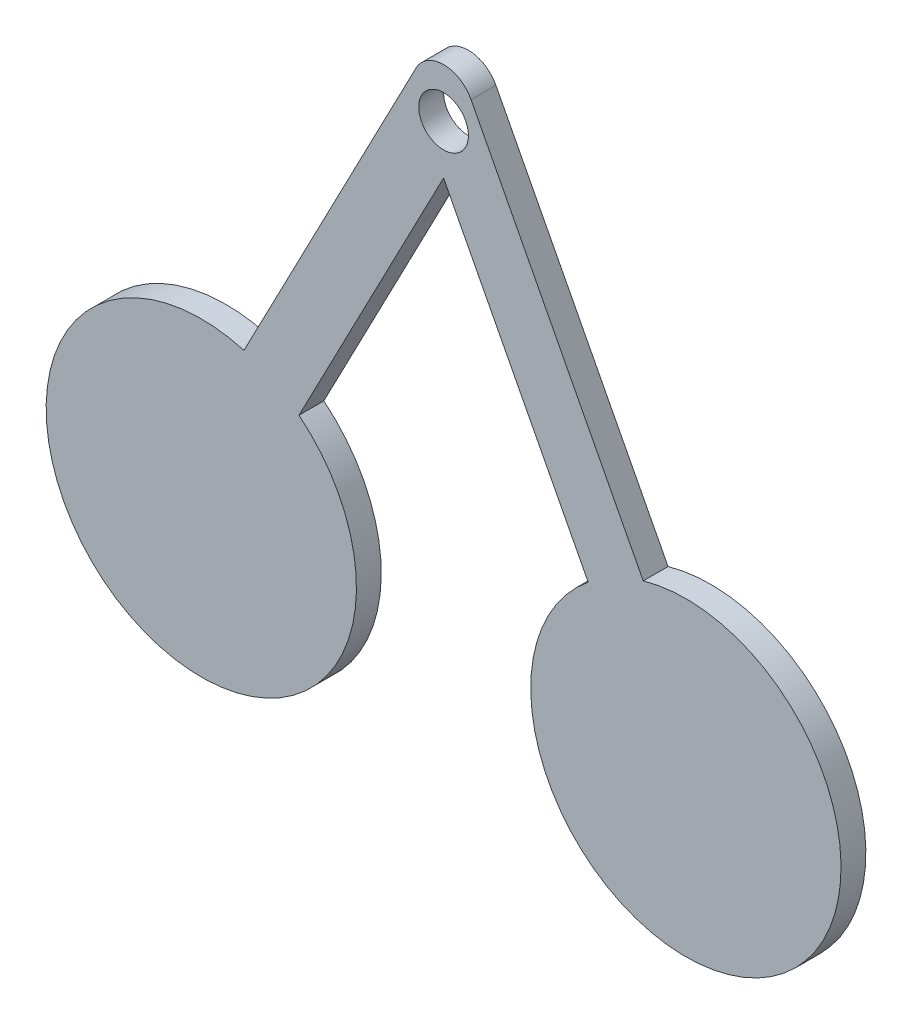
ISO-10303-21;
HEADER;
FILE_DESCRIPTION(('STEP AP214'),'2;1');
FILE_NAME('part.step','',(''),(''),'','','');
FILE_SCHEMA(('AUTOMOTIVE_DESIGN { 1 0 10303 214 1 1 1 1 }'));
ENDSEC;
DATA;
#1=APPLICATION_CONTEXT('core data for automotive mechanical design processes');
#2=APPLICATION_PROTOCOL_DEFINITION('international standard','automotive_design',2000,#1);
#3=PRODUCT_CONTEXT('',#1,'mechanical');
#4=PRODUCT('Part','Part','',(#3));
#5=PRODUCT_RELATED_PRODUCT_CATEGORY('part','',(#4));
#6=PRODUCT_DEFINITION_FORMATION('','',#4);
#7=PRODUCT_DEFINITION_CONTEXT('part definition',#1,'design');
#8=PRODUCT_DEFINITION('design','',#6,#7);
#9=PRODUCT_DEFINITION_SHAPE('','',#8);
#10=(LENGTH_UNIT() NAMED_UNIT(*) SI_UNIT(.MILLI.,.METRE.));
#11=(NAMED_UNIT(*) PLANE_ANGLE_UNIT() SI_UNIT($,.RADIAN.));
#12=(NAMED_UNIT(*) SI_UNIT($,.STERADIAN.) SOLID_ANGLE_UNIT());
#13=UNCERTAINTY_MEASURE_WITH_UNIT(LENGTH_MEASURE(1.E-05),#10,'distance_accuracy_value','');
#14=(GEOMETRIC_REPRESENTATION_CONTEXT(3) GLOBAL_UNCERTAINTY_ASSIGNED_CONTEXT((#13)) GLOBAL_UNIT_ASSIGNED_CONTEXT((#10,
#11,#12)) REPRESENTATION_CONTEXT('',''));
#15=CARTESIAN_POINT('',(0.,0.,0.));
#16=DIRECTION('',(0.,0.,1.));
#17=DIRECTION('',(1.,0.,0.));
#18=AXIS2_PLACEMENT_3D('',#15,#16,#17);
#19=CARTESIAN_POINT('',(39.0425287913807,0.,2.));
#20=DIRECTION('',(0.,0.,-1.));
#21=DIRECTION('',(-1.,0.,0.));
#22=AXIS2_PLACEMENT_3D('',#19,#20,#21);
#23=CYLINDRICAL_SURFACE('',#22,12.5);
#24=CARTESIAN_POINT('',(39.0425287913807,0.,0.));
#25=DIRECTION('',(0.,0.,1.));
#26=DIRECTION('',(1.,0.,0.));
#27=AXIS2_PLACEMENT_3D('',#24,#25,#26);
#28=CIRCLE('',#27,12.5);
#29=CARTESIAN_POINT('',(31.1697592491173,9.70924815495051,0.));
#30=VERTEX_POINT('',#29);
#31=CARTESIAN_POINT('',(35.6048134150085,12.0179912211257,0.));
#32=VERTEX_POINT('',#31);
#33=EDGE_CURVE('E138',#30,#32,#28,.T.);
#34=ORIENTED_EDGE('',*,*,#33,.T.);
#35=DIRECTION('',(0.,0.,-1.));
#36=VECTOR('',#35,1.);
#37=CARTESIAN_POINT('',(35.6048134150085,12.0179912211257,2.));
#38=LINE('',#37,#36);
#39=CARTESIAN_POINT('',(35.6048134150085,12.0179912211257,2.));
#40=VERTEX_POINT('',#39);
#41=EDGE_CURVE('E11',#40,#32,#38,.T.);
#42=ORIENTED_EDGE('',*,*,#41,.F.);
#43=CARTESIAN_POINT('',(39.0425287913807,0.,2.));
#44=DIRECTION('',(0.,0.,1.));
#45=DIRECTION('',(1.,0.,0.));
#46=AXIS2_PLACEMENT_3D('',#43,#44,#45);
#47=CIRCLE('',#46,12.5);
#48=CARTESIAN_POINT('',(31.1697592491173,9.70924815495051,2.));
#49=VERTEX_POINT('',#48);
#50=EDGE_CURVE('E158',#49,#40,#47,.T.);
#51=ORIENTED_EDGE('',*,*,#50,.F.);
#52=DIRECTION('',(0.,0.,-1.));
#53=VECTOR('',#52,1.);
#54=CARTESIAN_POINT('',(31.1697592491173,9.70924815495051,2.));
#55=LINE('',#54,#53);
#56=EDGE_CURVE('E134',#49,#30,#55,.T.);
#57=ORIENTED_EDGE('',*,*,#56,.T.);
#58=EDGE_LOOP('',(#34,#42,#51,#57));
#59=FACE_BOUND('',#58,.T.);
#60=ADVANCED_FACE('F43',(#59),#23,.T.);
#61=CARTESIAN_POINT('',(21.7387914786359,38.6543715330876,2.));
#62=DIRECTION('',(-0.887010833178223,-0.461748613235032,0.));
#63=DIRECTION('',(0.461748613235032,-0.887010833178223,0.));
#64=AXIS2_PLACEMENT_3D('',#61,#62,#63);
#65=PLANE('',#64);
#66=DIRECTION('',(-0.461748613235032,0.887010833178223,0.));
#67=VECTOR('',#66,1.);
#68=CARTESIAN_POINT('',(21.7387914786359,38.6543715330876,0.));
#69=LINE('',#68,#67);
#70=CARTESIAN_POINT('',(21.7387914786359,38.6543715330876,0.));
#71=VERTEX_POINT('',#70);
#72=EDGE_CURVE('E142',#32,#71,#69,.T.);
#73=ORIENTED_EDGE('',*,*,#72,.T.);
#74=DIRECTION('',(0.,0.,-1.));
#75=VECTOR('',#74,1.);
#76=CARTESIAN_POINT('',(21.7387914786359,38.6543715330876,2.));
#77=LINE('',#76,#75);
#78=CARTESIAN_POINT('',(21.7387914786359,38.6543715330876,2.));
#79=VERTEX_POINT('',#78);
#80=EDGE_CURVE('E52',#79,#71,#77,.T.);
#81=ORIENTED_EDGE('',*,*,#80,.F.);
#82=DIRECTION('',(-0.461748613235032,0.887010833178223,0.));
#83=VECTOR('',#82,1.);
#84=CARTESIAN_POINT('',(21.7387914786359,38.6543715330876,2.));
#85=LINE('',#84,#83);
#86=EDGE_CURVE('E100',#40,#79,#85,.T.);
#87=ORIENTED_EDGE('',*,*,#86,.F.);
#88=ORIENTED_EDGE('',*,*,#41,.T.);
#89=EDGE_LOOP('',(#73,#81,#87,#88));
#90=FACE_BOUND('',#89,.T.);
#91=ADVANCED_FACE('F215',(#90),#65,.F.);
#92=CARTESIAN_POINT('',(19.5212643956904,37.5,2.));
#93=DIRECTION('',(0.,0.,-1.));
#94=DIRECTION('',(-1.,0.,0.));
#95=AXIS2_PLACEMENT_3D('',#92,#93,#94);
#96=CYLINDRICAL_SURFACE('',#95,2.5);
#97=CARTESIAN_POINT('',(19.5212643956904,37.5,0.));
#98=DIRECTION('',(0.,0.,1.));
#99=DIRECTION('',(1.,0.,0.));
#100=AXIS2_PLACEMENT_3D('',#97,#98,#99);
#101=CIRCLE('',#100,2.5);
#102=CARTESIAN_POINT('',(17.3037373127448,38.6543715330876,0.));
#103=VERTEX_POINT('',#102);
#104=EDGE_CURVE('E146',#71,#103,#101,.T.);
#105=ORIENTED_EDGE('',*,*,#104,.T.);
#106=DIRECTION('',(0.,0.,-1.));
#107=VECTOR('',#106,1.);
#108=CARTESIAN_POINT('',(17.3037373127448,38.6543715330876,2.));
#109=LINE('',#108,#107);
#110=CARTESIAN_POINT('',(17.3037373127448,38.6543715330876,2.));
#111=VERTEX_POINT('',#110);
#112=EDGE_CURVE('E165',#111,#103,#109,.T.);
#113=ORIENTED_EDGE('',*,*,#112,.F.);
#114=CARTESIAN_POINT('',(19.5212643956904,37.5,2.));
#115=DIRECTION('',(0.,0.,1.));
#116=DIRECTION('',(1.,0.,0.));
#117=AXIS2_PLACEMENT_3D('',#114,#115,#116);
#118=CIRCLE('',#117,2.5);
#119=EDGE_CURVE('E175',#79,#111,#118,.T.);
#120=ORIENTED_EDGE('',*,*,#119,.F.);
#121=ORIENTED_EDGE('',*,*,#80,.T.);
#122=EDGE_LOOP('',(#105,#113,#120,#121));
#123=FACE_BOUND('',#122,.T.);
#124=ADVANCED_FACE('F173',(#123),#96,.T.);
#125=CARTESIAN_POINT('',(3.43771537637228,12.0179912211257,2.));
#126=DIRECTION('',(0.887010833178223,-0.461748613235032,0.));
#127=DIRECTION('',(0.461748613235032,0.887010833178223,0.));
#128=AXIS2_PLACEMENT_3D('',#125,#126,#127);
#129=PLANE('',#128);
#130=DIRECTION('',(-0.461748613235032,-0.887010833178223,0.));
#131=VECTOR('',#130,1.);
#132=CARTESIAN_POINT('',(3.43771537637228,12.0179912211257,0.));
#133=LINE('',#132,#131);
#134=CARTESIAN_POINT('',(3.43771537637228,12.0179912211257,0.));
#135=VERTEX_POINT('',#134);
#136=EDGE_CURVE('E149',#103,#135,#133,.T.);
#137=ORIENTED_EDGE('',*,*,#136,.T.);
#138=DIRECTION('',(0.,0.,-1.));
#139=VECTOR('',#138,1.);
#140=CARTESIAN_POINT('',(3.43771537637228,12.0179912211257,2.));
#141=LINE('',#140,#139);
#142=CARTESIAN_POINT('',(3.43771537637228,12.0179912211257,2.));
#143=VERTEX_POINT('',#142);
#144=EDGE_CURVE('E127',#143,#135,#141,.T.);
#145=ORIENTED_EDGE('',*,*,#144,.F.);
#146=DIRECTION('',(-0.461748613235032,-0.887010833178223,0.));
#147=VECTOR('',#146,1.);
#148=CARTESIAN_POINT('',(3.43771537637228,12.0179912211257,2.));
#149=LINE('',#148,#147);
#150=EDGE_CURVE('E116',#111,#143,#149,.T.);
#151=ORIENTED_EDGE('',*,*,#150,.F.);
#152=ORIENTED_EDGE('',*,*,#112,.T.);
#153=EDGE_LOOP('',(#137,#145,#151,#152));
#154=FACE_BOUND('',#153,.T.);
#155=ADVANCED_FACE('F181',(#154),#129,.F.);
#156=CARTESIAN_POINT('',(0.,0.,2.));
#157=DIRECTION('',(0.,0.,-1.));
#158=DIRECTION('',(-1.,0.,0.));
#159=AXIS2_PLACEMENT_3D('',#156,#157,#158);
#160=CYLINDRICAL_SURFACE('',#159,12.5);
#161=CARTESIAN_POINT('',(0.,0.,0.));
#162=DIRECTION('',(0.,0.,1.));
#163=DIRECTION('',(1.,0.,0.));
#164=AXIS2_PLACEMENT_3D('',#161,#162,#163);
#165=CIRCLE('',#164,12.5);
#166=CARTESIAN_POINT('',(7.87276954226339,9.70924815495051,0.));
#167=VERTEX_POINT('',#166);
#168=EDGE_CURVE('E125',#135,#167,#165,.T.);
#169=ORIENTED_EDGE('',*,*,#168,.T.);
#170=DIRECTION('',(0.,0.,-1.));
#171=VECTOR('',#170,1.);
#172=CARTESIAN_POINT('',(7.87276954226339,9.70924815495051,2.));
#173=LINE('',#172,#171);
#174=CARTESIAN_POINT('',(7.87276954226339,9.70924815495051,2.));
#175=VERTEX_POINT('',#174);
#176=EDGE_CURVE('E122',#175,#167,#173,.T.);
#177=ORIENTED_EDGE('',*,*,#176,.F.);
#178=CARTESIAN_POINT('',(0.,0.,2.));
#179=DIRECTION('',(0.,0.,1.));
#180=DIRECTION('',(1.,0.,0.));
#181=AXIS2_PLACEMENT_3D('',#178,#179,#180);
#182=CIRCLE('',#181,12.5);
#183=EDGE_CURVE('E110',#143,#175,#182,.T.);
#184=ORIENTED_EDGE('',*,*,#183,.F.);
#185=ORIENTED_EDGE('',*,*,#144,.T.);
#186=EDGE_LOOP('',(#169,#177,#184,#185));
#187=FACE_BOUND('',#186,.T.);
#188=ADVANCED_FACE('F123',(#187),#160,.T.);
#189=CARTESIAN_POINT('',(7.87276954226339,9.70924815495051,2.));
#190=DIRECTION('',(-0.887010833178223,0.461748613235032,0.));
#191=DIRECTION('',(-0.461748613235032,-0.887010833178223,0.));
#192=AXIS2_PLACEMENT_3D('',#189,#190,#191);
#193=PLANE('',#192);
#194=DIRECTION('',(0.461748613235032,0.887010833178223,0.));
#195=VECTOR('',#194,1.);
#196=CARTESIAN_POINT('',(7.87276954226339,9.70924815495051,0.));
#197=LINE('',#196,#195);
#198=CARTESIAN_POINT('',(19.5212643956904,32.0857985744995,0.));
#199=VERTEX_POINT('',#198);
#200=EDGE_CURVE('E86',#167,#199,#197,.T.);
#201=ORIENTED_EDGE('',*,*,#200,.T.);
#202=DIRECTION('',(0.,0.,-1.));
#203=VECTOR('',#202,1.);
#204=CARTESIAN_POINT('',(19.5212643956904,32.0857985744995,2.));
#205=LINE('',#204,#203);
#206=CARTESIAN_POINT('',(19.5212643956904,32.0857985744995,2.));
#207=VERTEX_POINT('',#206);
#208=EDGE_CURVE('E128',#207,#199,#205,.T.);
#209=ORIENTED_EDGE('',*,*,#208,.F.);
#210=DIRECTION('',(0.461748613235032,0.887010833178223,0.));
#211=VECTOR('',#210,1.);
#212=CARTESIAN_POINT('',(7.87276954226339,9.70924815495051,2.));
#213=LINE('',#212,#211);
#214=EDGE_CURVE('E114',#175,#207,#213,.T.);
#215=ORIENTED_EDGE('',*,*,#214,.F.);
#216=ORIENTED_EDGE('',*,*,#176,.T.);
#217=EDGE_LOOP('',(#201,#209,#215,#216));
#218=FACE_BOUND('',#217,.T.);
#219=ADVANCED_FACE('F130',(#218),#193,.F.);
#220=CARTESIAN_POINT('',(19.5212643956904,32.0857985744995,2.));
#221=DIRECTION('',(0.887010833178223,0.461748613235031,0.));
#222=DIRECTION('',(-0.461748613235031,0.887010833178223,0.));
#223=AXIS2_PLACEMENT_3D('',#220,#221,#222);
#224=PLANE('',#223);
#225=DIRECTION('',(0.461748613235031,-0.887010833178223,0.));
#226=VECTOR('',#225,1.);
#227=CARTESIAN_POINT('',(19.5212643956904,32.0857985744995,0.));
#228=LINE('',#227,#226);
#229=EDGE_CURVE('E92',#199,#30,#228,.T.);
#230=ORIENTED_EDGE('',*,*,#229,.T.);
#231=ORIENTED_EDGE('',*,*,#56,.F.);
#232=DIRECTION('',(0.461748613235031,-0.887010833178223,0.));
#233=VECTOR('',#232,1.);
#234=CARTESIAN_POINT('',(19.5212643956904,32.0857985744995,2.));
#235=LINE('',#234,#233);
#236=EDGE_CURVE('E60',#207,#49,#235,.T.);
#237=ORIENTED_EDGE('',*,*,#236,.F.);
#238=ORIENTED_EDGE('',*,*,#208,.T.);
#239=EDGE_LOOP('',(#230,#231,#237,#238));
#240=FACE_BOUND('',#239,.T.);
#241=ADVANCED_FACE('F206',(#240),#224,.F.);
#242=CARTESIAN_POINT('',(39.0425287913807,0.,2.));
#243=DIRECTION('',(0.,0.,1.));
#244=DIRECTION('',(1.,0.,0.));
#245=AXIS2_PLACEMENT_3D('',#242,#243,#244);
#246=PLANE('',#245);
#247=CARTESIAN_POINT('',(19.5212643956904,36.0428992872497,2.));
#248=DIRECTION('',(0.,0.,1.));
#249=DIRECTION('',(1.,0.,0.));
#250=AXIS2_PLACEMENT_3D('',#247,#248,#249);
#251=CIRCLE('',#250,2.00000000000001);
#252=CARTESIAN_POINT('',(21.5212643956904,36.0428992872497,2.));
#253=VERTEX_POINT('',#252);
#254=EDGE_CURVE('E190',#253,#253,#251,.T.);
#255=ORIENTED_EDGE('',*,*,#254,.F.);
#256=EDGE_LOOP('',(#255));
#257=FACE_BOUND('',#256,.T.);
#258=ORIENTED_EDGE('',*,*,#50,.T.);
#259=ORIENTED_EDGE('',*,*,#86,.T.);
#260=ORIENTED_EDGE('',*,*,#119,.T.);
#261=ORIENTED_EDGE('',*,*,#150,.T.);
#262=ORIENTED_EDGE('',*,*,#183,.T.);
#263=ORIENTED_EDGE('',*,*,#214,.T.);
#264=ORIENTED_EDGE('',*,*,#236,.T.);
#265=EDGE_LOOP('',(#258,#259,#260,#261,#262,#263,#264));
#266=FACE_BOUND('',#265,.T.);
#267=ADVANCED_FACE('F112',(#257,#266),#246,.T.);
#268=CARTESIAN_POINT('',(39.0425287913807,0.,0.));
#269=DIRECTION('',(0.,0.,1.));
#270=DIRECTION('',(1.,0.,0.));
#271=AXIS2_PLACEMENT_3D('',#268,#269,#270);
#272=PLANE('',#271);
#273=CARTESIAN_POINT('',(19.5212643956904,36.0428992872497,0.));
#274=DIRECTION('',(0.,0.,1.));
#275=DIRECTION('',(1.,0.,0.));
#276=AXIS2_PLACEMENT_3D('',#273,#274,#275);
#277=CIRCLE('',#276,2.00000000000001);
#278=CARTESIAN_POINT('',(21.5212643956904,36.0428992872497,0.));
#279=VERTEX_POINT('',#278);
#280=EDGE_CURVE('E143',#279,#279,#277,.T.);
#281=ORIENTED_EDGE('',*,*,#280,.T.);
#282=EDGE_LOOP('',(#281));
#283=FACE_BOUND('',#282,.T.);
#284=ORIENTED_EDGE('',*,*,#33,.F.);
#285=ORIENTED_EDGE('',*,*,#229,.F.);
#286=ORIENTED_EDGE('',*,*,#200,.F.);
#287=ORIENTED_EDGE('',*,*,#168,.F.);
#288=ORIENTED_EDGE('',*,*,#136,.F.);
#289=ORIENTED_EDGE('',*,*,#104,.F.);
#290=ORIENTED_EDGE('',*,*,#72,.F.);
#291=EDGE_LOOP('',(#284,#285,#286,#287,#288,#289,#290));
#292=FACE_BOUND('',#291,.T.);
#293=ADVANCED_FACE('F179',(#283,#292),#272,.F.);
#294=CARTESIAN_POINT('',(19.5212643956904,36.0428992872497,0.));
#295=DIRECTION('',(0.,0.,1.));
#296=DIRECTION('',(1.,0.,0.));
#297=AXIS2_PLACEMENT_3D('',#294,#295,#296);
#298=CYLINDRICAL_SURFACE('',#297,2.00000000000001);
#299=ORIENTED_EDGE('',*,*,#280,.F.);
#300=EDGE_LOOP('',(#299));
#301=FACE_BOUND('',#300,.T.);
#302=ORIENTED_EDGE('',*,*,#254,.T.);
#303=EDGE_LOOP('',(#302));
#304=FACE_BOUND('',#303,.T.);
#305=ADVANCED_FACE('F199',(#301,#304),#298,.F.);
#306=CLOSED_SHELL('',(#60,#91,#124,#155,#188,#219,#241,#267,#293,#305));
#307=MANIFOLD_SOLID_BREP('B2',#306);
#308=ADVANCED_BREP_SHAPE_REPRESENTATION('',(#18,#307),#14);
#309=SHAPE_DEFINITION_REPRESENTATION(#9,#308);
ENDSEC;
END-ISO-10303-21;
